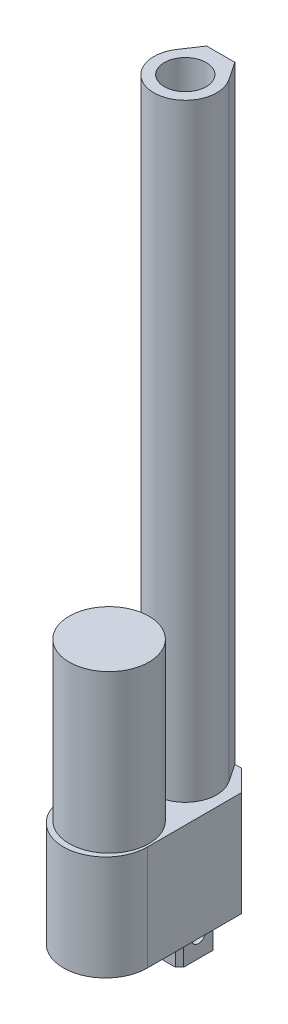
ISO-10303-21;
HEADER;
FILE_DESCRIPTION(('STEP AP214'),'2;1');
FILE_NAME('part.step','',(''),(''),'','','');
FILE_SCHEMA(('AUTOMOTIVE_DESIGN { 1 0 10303 214 1 1 1 1 }'));
ENDSEC;
DATA;
#1=APPLICATION_CONTEXT('core data for automotive mechanical design processes');
#2=APPLICATION_PROTOCOL_DEFINITION('international standard','automotive_design',2000,#1);
#3=PRODUCT_CONTEXT('',#1,'mechanical');
#4=PRODUCT('Part','Part','',(#3));
#5=PRODUCT_RELATED_PRODUCT_CATEGORY('part','',(#4));
#6=PRODUCT_DEFINITION_FORMATION('','',#4);
#7=PRODUCT_DEFINITION_CONTEXT('part definition',#1,'design');
#8=PRODUCT_DEFINITION('design','',#6,#7);
#9=PRODUCT_DEFINITION_SHAPE('','',#8);
#10=(LENGTH_UNIT() NAMED_UNIT(*) SI_UNIT(.MILLI.,.METRE.));
#11=(NAMED_UNIT(*) PLANE_ANGLE_UNIT() SI_UNIT($,.RADIAN.));
#12=(NAMED_UNIT(*) SI_UNIT($,.STERADIAN.) SOLID_ANGLE_UNIT());
#13=UNCERTAINTY_MEASURE_WITH_UNIT(LENGTH_MEASURE(1.E-05),#10,'distance_accuracy_value','');
#14=(GEOMETRIC_REPRESENTATION_CONTEXT(3) GLOBAL_UNCERTAINTY_ASSIGNED_CONTEXT((#13)) GLOBAL_UNIT_ASSIGNED_CONTEXT((#10,
#11,#12)) REPRESENTATION_CONTEXT('',''));
#15=CARTESIAN_POINT('',(0.,0.,0.));
#16=DIRECTION('',(0.,0.,1.));
#17=DIRECTION('',(1.,0.,0.));
#18=AXIS2_PLACEMENT_3D('',#15,#16,#17);
#19=CARTESIAN_POINT('',(0.,0.,27.5));
#20=DIRECTION('',(0.,1.,0.));
#21=DIRECTION('',(0.,0.,1.));
#22=AXIS2_PLACEMENT_3D('',#19,#20,#21);
#23=PLANE('',#22);
#24=DIRECTION('',(-1.,0.,0.));
#25=VECTOR('',#24,1.);
#26=CARTESIAN_POINT('',(-20.,0.,-27.5));
#27=LINE('',#26,#25);
#28=CARTESIAN_POINT('',(9.99999999999993,0.,-27.5));
#29=VERTEX_POINT('',#28);
#30=CARTESIAN_POINT('',(-10.,0.,-27.5));
#31=VERTEX_POINT('',#30);
#32=EDGE_CURVE('E217',#29,#31,#27,.T.);
#33=ORIENTED_EDGE('',*,*,#32,.F.);
#34=DIRECTION('',(-0.707106781186548,0.,-0.707106781186547));
#35=VECTOR('',#34,1.);
#36=CARTESIAN_POINT('',(9.99999999999993,0.,-27.5));
#37=LINE('',#36,#35);
#38=CARTESIAN_POINT('',(20.,0.,-17.4999999999999));
#39=VERTEX_POINT('',#38);
#40=EDGE_CURVE('E238',#29,#39,#37,.F.);
#41=ORIENTED_EDGE('',*,*,#40,.T.);
#42=DIRECTION('',(0.,0.,-1.));
#43=VECTOR('',#42,1.);
#44=CARTESIAN_POINT('',(20.,0.,-27.5));
#45=LINE('',#44,#43);
#46=CARTESIAN_POINT('',(20.,0.,27.5));
#47=VERTEX_POINT('',#46);
#48=EDGE_CURVE('E214',#47,#39,#45,.T.);
#49=ORIENTED_EDGE('',*,*,#48,.F.);
#50=CARTESIAN_POINT('',(0.,0.,27.5));
#51=DIRECTION('',(0.,1.,0.));
#52=DIRECTION('',(0.,0.,1.));
#53=AXIS2_PLACEMENT_3D('',#50,#51,#52);
#54=CIRCLE('',#53,20.);
#55=CARTESIAN_POINT('',(-20.,0.,27.5));
#56=VERTEX_POINT('',#55);
#57=EDGE_CURVE('E197',#56,#47,#54,.T.);
#58=ORIENTED_EDGE('',*,*,#57,.F.);
#59=DIRECTION('',(0.,0.,1.));
#60=VECTOR('',#59,1.);
#61=CARTESIAN_POINT('',(-20.,0.,-27.5));
#62=LINE('',#61,#60);
#63=CARTESIAN_POINT('',(-20.,0.,-17.5));
#64=VERTEX_POINT('',#63);
#65=EDGE_CURVE('E203',#64,#56,#62,.T.);
#66=ORIENTED_EDGE('',*,*,#65,.F.);
#67=DIRECTION('',(-0.70710678118655,0.,0.707106781186546));
#68=VECTOR('',#67,1.);
#69=CARTESIAN_POINT('',(-20.,0.,-17.5));
#70=LINE('',#69,#68);
#71=EDGE_CURVE('E236',#64,#31,#70,.F.);
#72=ORIENTED_EDGE('',*,*,#71,.T.);
#73=EDGE_LOOP('',(#33,#41,#49,#58,#66,#72));
#74=FACE_BOUND('',#73,.T.);
#75=DIRECTION('',(0.,0.,1.));
#76=VECTOR('',#75,1.);
#77=CARTESIAN_POINT('',(9.3326219700396,0.,1.5));
#78=LINE('',#77,#76);
#79=CARTESIAN_POINT('',(9.3326219700396,0.,-14.5));
#80=VERTEX_POINT('',#79);
#81=CARTESIAN_POINT('',(9.3326219700396,0.,-0.5));
#82=VERTEX_POINT('',#81);
#83=EDGE_CURVE('E230',#80,#82,#78,.T.);
#84=ORIENTED_EDGE('',*,*,#83,.F.);
#85=DIRECTION('',(0.707106781186548,0.,0.707106781186547));
#86=VECTOR('',#85,1.);
#87=CARTESIAN_POINT('',(25.6663109850198,0.,1.83368901498018));
#88=LINE('',#87,#86);
#89=CARTESIAN_POINT('',(7.3326219700396,0.,-16.5));
#90=VERTEX_POINT('',#89);
#91=EDGE_CURVE('E45',#80,#90,#88,.F.);
#92=ORIENTED_EDGE('',*,*,#91,.T.);
#93=DIRECTION('',(1.,0.,0.));
#94=VECTOR('',#93,1.);
#95=CARTESIAN_POINT('',(-8.6673780299604,0.,-16.5));
#96=LINE('',#95,#94);
#97=CARTESIAN_POINT('',(-6.6673780299604,0.,-16.5));
#98=VERTEX_POINT('',#97);
#99=EDGE_CURVE('E309',#98,#90,#96,.T.);
#100=ORIENTED_EDGE('',*,*,#99,.F.);
#101=DIRECTION('',(0.707106781186548,0.,-0.707106781186548));
#102=VECTOR('',#101,1.);
#103=CARTESIAN_POINT('',(-25.3336890149802,0.,2.16631098501981));
#104=LINE('',#103,#102);
#105=CARTESIAN_POINT('',(-8.6673780299604,0.,-14.5));
#106=VERTEX_POINT('',#105);
#107=EDGE_CURVE('E11',#98,#106,#104,.F.);
#108=ORIENTED_EDGE('',*,*,#107,.T.);
#109=DIRECTION('',(0.,0.,-1.));
#110=VECTOR('',#109,1.);
#111=CARTESIAN_POINT('',(-8.6673780299604,0.,1.5));
#112=LINE('',#111,#110);
#113=CARTESIAN_POINT('',(-8.6673780299604,0.,-0.499999999999945));
#114=VERTEX_POINT('',#113);
#115=EDGE_CURVE('E317',#114,#106,#112,.T.);
#116=ORIENTED_EDGE('',*,*,#115,.F.);
#117=DIRECTION('',(-0.707106781186548,0.,-0.707106781186548));
#118=VECTOR('',#117,1.);
#119=CARTESIAN_POINT('',(9.66631098501977,0.,17.8336890149802));
#120=LINE('',#119,#118);
#121=CARTESIAN_POINT('',(-6.66737802996046,0.,1.5));
#122=VERTEX_POINT('',#121);
#123=EDGE_CURVE('E276',#114,#122,#120,.F.);
#124=ORIENTED_EDGE('',*,*,#123,.T.);
#125=DIRECTION('',(-1.,0.,0.));
#126=VECTOR('',#125,1.);
#127=CARTESIAN_POINT('',(-8.6673780299604,0.,1.5));
#128=LINE('',#127,#126);
#129=CARTESIAN_POINT('',(7.33262197003959,0.,1.5));
#130=VERTEX_POINT('',#129);
#131=EDGE_CURVE('E282',#130,#122,#128,.T.);
#132=ORIENTED_EDGE('',*,*,#131,.F.);
#133=DIRECTION('',(-0.707106781186548,0.,0.707106781186548));
#134=VECTOR('',#133,1.);
#135=CARTESIAN_POINT('',(-9.3336890149802,0.,18.1663109850198));
#136=LINE('',#135,#134);
#137=EDGE_CURVE('E278',#130,#82,#136,.F.);
#138=ORIENTED_EDGE('',*,*,#137,.T.);
#139=EDGE_LOOP('',(#84,#92,#100,#108,#116,#124,#132,#138));
#140=FACE_BOUND('',#139,.T.);
#141=ADVANCED_FACE('F37',(#74,#140),#23,.F.);
#142=CARTESIAN_POINT('',(0.,50.,27.5));
#143=DIRECTION('',(0.,1.,0.));
#144=DIRECTION('',(0.,0.,1.));
#145=AXIS2_PLACEMENT_3D('',#142,#143,#144);
#146=PLANE('',#145);
#147=CARTESIAN_POINT('',(0.,50.,25.7726123452185));
#148=DIRECTION('',(0.,1.,0.));
#149=DIRECTION('',(0.,0.,1.));
#150=AXIS2_PLACEMENT_3D('',#147,#148,#149);
#151=CIRCLE('',#150,19.);
#152=CARTESIAN_POINT('',(0.,50.,44.7726123452185));
#153=VERTEX_POINT('',#152);
#154=EDGE_CURVE('E187',#153,#153,#151,.T.);
#155=ORIENTED_EDGE('',*,*,#154,.F.);
#156=EDGE_LOOP('',(#155));
#157=FACE_BOUND('',#156,.T.);
#158=DIRECTION('',(0.,0.,-1.));
#159=VECTOR('',#158,1.);
#160=CARTESIAN_POINT('',(20.,50.,-27.5));
#161=LINE('',#160,#159);
#162=CARTESIAN_POINT('',(20.,50.,27.5));
#163=VERTEX_POINT('',#162);
#164=CARTESIAN_POINT('',(20.,50.,-17.4999999999999));
#165=VERTEX_POINT('',#164);
#166=EDGE_CURVE('E202',#163,#165,#161,.T.);
#167=ORIENTED_EDGE('',*,*,#166,.T.);
#168=DIRECTION('',(0.707106781186548,0.,0.707106781186547));
#169=VECTOR('',#168,1.);
#170=CARTESIAN_POINT('',(32.5,50.,-4.99999999999997));
#171=LINE('',#170,#169);
#172=CARTESIAN_POINT('',(9.99999999999993,50.,-27.5));
#173=VERTEX_POINT('',#172);
#174=EDGE_CURVE('E244',#165,#173,#171,.F.);
#175=ORIENTED_EDGE('',*,*,#174,.T.);
#176=DIRECTION('',(-1.,0.,0.));
#177=VECTOR('',#176,1.);
#178=CARTESIAN_POINT('',(-20.,50.,-27.5));
#179=LINE('',#178,#177);
#180=CARTESIAN_POINT('',(6.73777580045175,50.,-27.5));
#181=VERTEX_POINT('',#180);
#182=EDGE_CURVE('E207',#173,#181,#179,.T.);
#183=ORIENTED_EDGE('',*,*,#182,.T.);
#184=DIRECTION('',(-0.555448260150939,0.,-0.831551099028373));
#185=VECTOR('',#184,1.);
#186=CARTESIAN_POINT('',(12.4732664854256,50.,-18.9135052268218));
#187=LINE('',#186,#185);
#188=CARTESIAN_POINT('',(12.4732664854256,50.,-18.9135052268218));
#189=VERTEX_POINT('',#188);
#190=EDGE_CURVE('E330',#189,#181,#187,.T.);
#191=ORIENTED_EDGE('',*,*,#190,.F.);
#192=CARTESIAN_POINT('',(0.,50.,-10.5817813245577));
#193=DIRECTION('',(0.,1.,0.));
#194=DIRECTION('',(0.,0.,1.));
#195=AXIS2_PLACEMENT_3D('',#192,#193,#194);
#196=CIRCLE('',#195,15.);
#197=CARTESIAN_POINT('',(-12.4732664854256,50.,-18.9135052268218));
#198=VERTEX_POINT('',#197);
#199=EDGE_CURVE('E185',#198,#189,#196,.T.);
#200=ORIENTED_EDGE('',*,*,#199,.F.);
#201=DIRECTION('',(-0.555448260150939,0.,0.831551099028373));
#202=VECTOR('',#201,1.);
#203=CARTESIAN_POINT('',(-12.4732664854256,50.,-18.9135052268218));
#204=LINE('',#203,#202);
#205=CARTESIAN_POINT('',(-6.73777580045176,50.,-27.5));
#206=VERTEX_POINT('',#205);
#207=EDGE_CURVE('E181',#206,#198,#204,.T.);
#208=ORIENTED_EDGE('',*,*,#207,.F.);
#209=CARTESIAN_POINT('',(-10.,50.,-27.5));
#210=VERTEX_POINT('',#209);
#211=EDGE_CURVE('E206',#206,#210,#179,.T.);
#212=ORIENTED_EDGE('',*,*,#211,.T.);
#213=DIRECTION('',(0.70710678118655,0.,-0.707106781186546));
#214=VECTOR('',#213,1.);
#215=CARTESIAN_POINT('',(-32.5,50.,-5.00000000000016));
#216=LINE('',#215,#214);
#217=CARTESIAN_POINT('',(-20.,50.,-17.5));
#218=VERTEX_POINT('',#217);
#219=EDGE_CURVE('E242',#210,#218,#216,.F.);
#220=ORIENTED_EDGE('',*,*,#219,.T.);
#221=DIRECTION('',(0.,0.,1.));
#222=VECTOR('',#221,1.);
#223=CARTESIAN_POINT('',(-20.,50.,-27.5));
#224=LINE('',#223,#222);
#225=CARTESIAN_POINT('',(-20.,50.,27.5));
#226=VERTEX_POINT('',#225);
#227=EDGE_CURVE('E209',#218,#226,#224,.T.);
#228=ORIENTED_EDGE('',*,*,#227,.T.);
#229=CARTESIAN_POINT('',(0.,50.,27.5));
#230=DIRECTION('',(0.,1.,0.));
#231=DIRECTION('',(0.,0.,1.));
#232=AXIS2_PLACEMENT_3D('',#229,#230,#231);
#233=CIRCLE('',#232,20.);
#234=EDGE_CURVE('E199',#226,#163,#233,.T.);
#235=ORIENTED_EDGE('',*,*,#234,.T.);
#236=EDGE_LOOP('',(#167,#175,#183,#191,#200,#208,#212,#220,#228,#235));
#237=FACE_BOUND('',#236,.T.);
#238=ADVANCED_FACE('F341',(#157,#237),#146,.T.);
#239=CARTESIAN_POINT('',(0.,50.,27.5));
#240=DIRECTION('',(0.,-1.,0.));
#241=DIRECTION('',(0.,0.,-1.));
#242=AXIS2_PLACEMENT_3D('',#239,#240,#241);
#243=CYLINDRICAL_SURFACE('',#242,20.);
#244=ORIENTED_EDGE('',*,*,#57,.T.);
#245=DIRECTION('',(0.,-1.,0.));
#246=VECTOR('',#245,1.);
#247=CARTESIAN_POINT('',(20.,50.,27.5));
#248=LINE('',#247,#246);
#249=EDGE_CURVE('E223',#163,#47,#248,.T.);
#250=ORIENTED_EDGE('',*,*,#249,.F.);
#251=ORIENTED_EDGE('',*,*,#234,.F.);
#252=DIRECTION('',(0.,-1.,0.));
#253=VECTOR('',#252,1.);
#254=CARTESIAN_POINT('',(-20.,50.,27.5));
#255=LINE('',#254,#253);
#256=EDGE_CURVE('E211',#226,#56,#255,.T.);
#257=ORIENTED_EDGE('',*,*,#256,.T.);
#258=EDGE_LOOP('',(#244,#250,#251,#257));
#259=FACE_BOUND('',#258,.T.);
#260=ADVANCED_FACE('F359',(#259),#243,.T.);
#261=CARTESIAN_POINT('',(20.,50.,-27.5));
#262=DIRECTION('',(-1.,0.,0.));
#263=DIRECTION('',(0.,0.,1.));
#264=AXIS2_PLACEMENT_3D('',#261,#262,#263);
#265=PLANE('',#264);
#266=ORIENTED_EDGE('',*,*,#48,.T.);
#267=DIRECTION('',(0.,1.,0.));
#268=VECTOR('',#267,1.);
#269=CARTESIAN_POINT('',(20.,50.,-17.4999999999999));
#270=LINE('',#269,#268);
#271=EDGE_CURVE('E240',#39,#165,#270,.T.);
#272=ORIENTED_EDGE('',*,*,#271,.T.);
#273=ORIENTED_EDGE('',*,*,#166,.F.);
#274=ORIENTED_EDGE('',*,*,#249,.T.);
#275=EDGE_LOOP('',(#266,#272,#273,#274));
#276=FACE_BOUND('',#275,.T.);
#277=ADVANCED_FACE('F367',(#276),#265,.F.);
#278=CARTESIAN_POINT('',(-20.,50.,-27.5));
#279=DIRECTION('',(0.,0.,1.));
#280=DIRECTION('',(1.,0.,0.));
#281=AXIS2_PLACEMENT_3D('',#278,#279,#280);
#282=PLANE('',#281);
#283=ORIENTED_EDGE('',*,*,#182,.F.);
#284=DIRECTION('',(0.,-1.,0.));
#285=VECTOR('',#284,1.);
#286=CARTESIAN_POINT('',(9.99999999999993,50.,-27.5));
#287=LINE('',#286,#285);
#288=EDGE_CURVE('E233',#173,#29,#287,.T.);
#289=ORIENTED_EDGE('',*,*,#288,.T.);
#290=ORIENTED_EDGE('',*,*,#32,.T.);
#291=DIRECTION('',(0.,1.,0.));
#292=VECTOR('',#291,1.);
#293=CARTESIAN_POINT('',(-10.,50.,-27.5));
#294=LINE('',#293,#292);
#295=EDGE_CURVE('E226',#31,#210,#294,.T.);
#296=ORIENTED_EDGE('',*,*,#295,.T.);
#297=ORIENTED_EDGE('',*,*,#211,.F.);
#298=DIRECTION('',(0.,-1.,0.));
#299=VECTOR('',#298,1.);
#300=CARTESIAN_POINT('',(-6.73777580045175,340.,-27.5));
#301=LINE('',#300,#299);
#302=CARTESIAN_POINT('',(-6.73777580045175,340.,-27.5));
#303=VERTEX_POINT('',#302);
#304=EDGE_CURVE('E192',#303,#206,#301,.T.);
#305=ORIENTED_EDGE('',*,*,#304,.F.);
#306=DIRECTION('',(-1.,0.,0.));
#307=VECTOR('',#306,1.);
#308=CARTESIAN_POINT('',(-6.73777580045175,340.,-27.5));
#309=LINE('',#308,#307);
#310=CARTESIAN_POINT('',(6.73777580045175,340.,-27.5));
#311=VERTEX_POINT('',#310);
#312=EDGE_CURVE('E171',#311,#303,#309,.T.);
#313=ORIENTED_EDGE('',*,*,#312,.F.);
#314=DIRECTION('',(0.,-1.,0.));
#315=VECTOR('',#314,1.);
#316=CARTESIAN_POINT('',(6.73777580045175,340.,-27.5));
#317=LINE('',#316,#315);
#318=EDGE_CURVE('E168',#311,#181,#317,.T.);
#319=ORIENTED_EDGE('',*,*,#318,.T.);
#320=EDGE_LOOP('',(#283,#289,#290,#296,#297,#305,#313,#319));
#321=FACE_BOUND('',#320,.T.);
#322=ADVANCED_FACE('F344',(#321),#282,.F.);
#323=CARTESIAN_POINT('',(-20.,50.,-27.5));
#324=DIRECTION('',(1.,0.,0.));
#325=DIRECTION('',(0.,0.,-1.));
#326=AXIS2_PLACEMENT_3D('',#323,#324,#325);
#327=PLANE('',#326);
#328=ORIENTED_EDGE('',*,*,#227,.F.);
#329=DIRECTION('',(0.,-1.,0.));
#330=VECTOR('',#329,1.);
#331=CARTESIAN_POINT('',(-20.,50.,-17.5));
#332=LINE('',#331,#330);
#333=EDGE_CURVE('E246',#218,#64,#332,.T.);
#334=ORIENTED_EDGE('',*,*,#333,.T.);
#335=ORIENTED_EDGE('',*,*,#65,.T.);
#336=ORIENTED_EDGE('',*,*,#256,.F.);
#337=EDGE_LOOP('',(#328,#334,#335,#336));
#338=FACE_BOUND('',#337,.T.);
#339=ADVANCED_FACE('F353',(#338),#327,.F.);
#340=CARTESIAN_POINT('',(0.,125.,25.7726123452185));
#341=DIRECTION('',(0.,-1.,0.));
#342=DIRECTION('',(0.,0.,-1.));
#343=AXIS2_PLACEMENT_3D('',#340,#341,#342);
#344=CYLINDRICAL_SURFACE('',#343,19.);
#345=CARTESIAN_POINT('',(0.,125.,25.7726123452185));
#346=DIRECTION('',(0.,1.,0.));
#347=DIRECTION('',(0.,0.,1.));
#348=AXIS2_PLACEMENT_3D('',#345,#346,#347);
#349=CIRCLE('',#348,19.);
#350=CARTESIAN_POINT('',(0.,125.,44.7726123452185));
#351=VERTEX_POINT('',#350);
#352=EDGE_CURVE('E190',#351,#351,#349,.T.);
#353=ORIENTED_EDGE('',*,*,#352,.F.);
#354=EDGE_LOOP('',(#353));
#355=FACE_BOUND('',#354,.T.);
#356=ORIENTED_EDGE('',*,*,#154,.T.);
#357=EDGE_LOOP('',(#356));
#358=FACE_BOUND('',#357,.T.);
#359=ADVANCED_FACE('F386',(#355,#358),#344,.T.);
#360=CARTESIAN_POINT('',(0.,125.,25.7726123452185));
#361=DIRECTION('',(0.,1.,0.));
#362=DIRECTION('',(0.,0.,1.));
#363=AXIS2_PLACEMENT_3D('',#360,#361,#362);
#364=PLANE('',#363);
#365=ORIENTED_EDGE('',*,*,#352,.T.);
#366=EDGE_LOOP('',(#365));
#367=FACE_BOUND('',#366,.T.);
#368=ADVANCED_FACE('F390',(#367),#364,.T.);
#369=CARTESIAN_POINT('',(0.,340.,-10.5817813245577));
#370=DIRECTION('',(0.,-1.,0.));
#371=DIRECTION('',(0.,0.,-1.));
#372=AXIS2_PLACEMENT_3D('',#369,#370,#371);
#373=CYLINDRICAL_SURFACE('',#372,15.);
#374=ORIENTED_EDGE('',*,*,#199,.T.);
#375=DIRECTION('',(0.,-1.,0.));
#376=VECTOR('',#375,1.);
#377=CARTESIAN_POINT('',(12.4732664854256,340.,-18.9135052268218));
#378=LINE('',#377,#376);
#379=CARTESIAN_POINT('',(12.4732664854256,340.,-18.9135052268218));
#380=VERTEX_POINT('',#379);
#381=EDGE_CURVE('E165',#380,#189,#378,.T.);
#382=ORIENTED_EDGE('',*,*,#381,.F.);
#383=CARTESIAN_POINT('',(0.,340.,-10.5817813245577));
#384=DIRECTION('',(0.,1.,0.));
#385=DIRECTION('',(0.,0.,1.));
#386=AXIS2_PLACEMENT_3D('',#383,#384,#385);
#387=CIRCLE('',#386,15.);
#388=CARTESIAN_POINT('',(-12.4732664854256,340.,-18.9135052268218));
#389=VERTEX_POINT('',#388);
#390=EDGE_CURVE('E172',#389,#380,#387,.T.);
#391=ORIENTED_EDGE('',*,*,#390,.F.);
#392=DIRECTION('',(0.,-1.,0.));
#393=VECTOR('',#392,1.);
#394=CARTESIAN_POINT('',(-12.4732664854256,340.,-18.9135052268218));
#395=LINE('',#394,#393);
#396=EDGE_CURVE('E328',#389,#198,#395,.T.);
#397=ORIENTED_EDGE('',*,*,#396,.T.);
#398=EDGE_LOOP('',(#374,#382,#391,#397));
#399=FACE_BOUND('',#398,.T.);
#400=ADVANCED_FACE('F183',(#399),#373,.T.);
#401=CARTESIAN_POINT('',(12.4732664854256,340.,-18.9135052268218));
#402=DIRECTION('',(-0.831551099028373,0.,0.555448260150939));
#403=DIRECTION('',(0.555448260150939,0.,0.831551099028373));
#404=AXIS2_PLACEMENT_3D('',#401,#402,#403);
#405=PLANE('',#404);
#406=ORIENTED_EDGE('',*,*,#190,.T.);
#407=ORIENTED_EDGE('',*,*,#318,.F.);
#408=DIRECTION('',(-0.555448260150939,0.,-0.831551099028373));
#409=VECTOR('',#408,1.);
#410=CARTESIAN_POINT('',(12.4732664854256,340.,-18.9135052268218));
#411=LINE('',#410,#409);
#412=EDGE_CURVE('E160',#380,#311,#411,.T.);
#413=ORIENTED_EDGE('',*,*,#412,.F.);
#414=ORIENTED_EDGE('',*,*,#381,.T.);
#415=EDGE_LOOP('',(#406,#407,#413,#414));
#416=FACE_BOUND('',#415,.T.);
#417=ADVANCED_FACE('F163',(#416),#405,.F.);
#418=CARTESIAN_POINT('',(-12.4732664854256,340.,-18.9135052268218));
#419=DIRECTION('',(0.831551099028373,0.,0.555448260150939));
#420=DIRECTION('',(0.555448260150939,0.,-0.831551099028373));
#421=AXIS2_PLACEMENT_3D('',#418,#419,#420);
#422=PLANE('',#421);
#423=ORIENTED_EDGE('',*,*,#207,.T.);
#424=ORIENTED_EDGE('',*,*,#396,.F.);
#425=DIRECTION('',(-0.555448260150939,0.,0.831551099028373));
#426=VECTOR('',#425,1.);
#427=CARTESIAN_POINT('',(-12.4732664854256,340.,-18.9135052268218));
#428=LINE('',#427,#426);
#429=EDGE_CURVE('E177',#303,#389,#428,.T.);
#430=ORIENTED_EDGE('',*,*,#429,.F.);
#431=ORIENTED_EDGE('',*,*,#304,.T.);
#432=EDGE_LOOP('',(#423,#424,#430,#431));
#433=FACE_BOUND('',#432,.T.);
#434=ADVANCED_FACE('F336',(#433),#422,.F.);
#435=CARTESIAN_POINT('',(0.,340.,-10.5817813245577));
#436=DIRECTION('',(0.,1.,0.));
#437=DIRECTION('',(0.,0.,1.));
#438=AXIS2_PLACEMENT_3D('',#435,#436,#437);
#439=PLANE('',#438);
#440=CARTESIAN_POINT('',(0.,340.,-10.5817813245577));
#441=DIRECTION('',(0.,1.,0.));
#442=DIRECTION('',(0.,0.,1.));
#443=AXIS2_PLACEMENT_3D('',#440,#441,#442);
#444=CIRCLE('',#443,10.);
#445=CARTESIAN_POINT('',(0.,340.,-0.581781324557676));
#446=VERTEX_POINT('',#445);
#447=EDGE_CURVE('E314',#446,#446,#444,.T.);
#448=ORIENTED_EDGE('',*,*,#447,.F.);
#449=EDGE_LOOP('',(#448));
#450=FACE_BOUND('',#449,.T.);
#451=ORIENTED_EDGE('',*,*,#390,.T.);
#452=ORIENTED_EDGE('',*,*,#412,.T.);
#453=ORIENTED_EDGE('',*,*,#312,.T.);
#454=ORIENTED_EDGE('',*,*,#429,.T.);
#455=EDGE_LOOP('',(#451,#452,#453,#454));
#456=FACE_BOUND('',#455,.T.);
#457=ADVANCED_FACE('F175',(#450,#456),#439,.T.);
#458=CARTESIAN_POINT('',(0.,170.,-10.5817813245577));
#459=DIRECTION('',(0.,1.,0.));
#460=DIRECTION('',(0.,0.,1.));
#461=AXIS2_PLACEMENT_3D('',#458,#459,#460);
#462=CYLINDRICAL_SURFACE('',#461,10.);
#463=CARTESIAN_POINT('',(0.,170.,-10.5817813245577));
#464=DIRECTION('',(0.,1.,0.));
#465=DIRECTION('',(0.,0.,1.));
#466=AXIS2_PLACEMENT_3D('',#463,#464,#465);
#467=CIRCLE('',#466,10.);
#468=CARTESIAN_POINT('',(0.,170.,-0.581781324557676));
#469=VERTEX_POINT('',#468);
#470=EDGE_CURVE('E321',#469,#469,#467,.T.);
#471=ORIENTED_EDGE('',*,*,#470,.F.);
#472=EDGE_LOOP('',(#471));
#473=FACE_BOUND('',#472,.T.);
#474=ORIENTED_EDGE('',*,*,#447,.T.);
#475=EDGE_LOOP('',(#474));
#476=FACE_BOUND('',#475,.T.);
#477=ADVANCED_FACE('F408',(#473,#476),#462,.F.);
#478=CARTESIAN_POINT('',(0.,170.,-10.5817813245577));
#479=DIRECTION('',(0.,1.,0.));
#480=DIRECTION('',(0.,0.,1.));
#481=AXIS2_PLACEMENT_3D('',#478,#479,#480);
#482=PLANE('',#481);
#483=ORIENTED_EDGE('',*,*,#470,.T.);
#484=EDGE_LOOP('',(#483));
#485=FACE_BOUND('',#484,.T.);
#486=ADVANCED_FACE('F412',(#485),#482,.T.);
#487=CARTESIAN_POINT('',(9.3326219700396,-19.,1.5));
#488=DIRECTION('',(-1.,0.,0.));
#489=DIRECTION('',(0.,0.,1.));
#490=AXIS2_PLACEMENT_3D('',#487,#488,#489);
#491=PLANE('',#490);
#492=CARTESIAN_POINT('',(9.3326219700396,-9.5,-7.5));
#493=DIRECTION('',(1.,0.,0.));
#494=DIRECTION('',(0.,0.,-1.));
#495=AXIS2_PLACEMENT_3D('',#492,#493,#494);
#496=CIRCLE('',#495,3.25);
#497=CARTESIAN_POINT('',(9.3326219700396,-9.5,-10.75));
#498=VERTEX_POINT('',#497);
#499=EDGE_CURVE('E231',#498,#498,#496,.T.);
#500=ORIENTED_EDGE('',*,*,#499,.F.);
#501=EDGE_LOOP('',(#500));
#502=FACE_BOUND('',#501,.T.);
#503=ORIENTED_EDGE('',*,*,#83,.T.);
#504=DIRECTION('',(0.,-1.,0.));
#505=VECTOR('',#504,1.);
#506=CARTESIAN_POINT('',(9.3326219700396,-19.,-0.5));
#507=LINE('',#506,#505);
#508=CARTESIAN_POINT('',(9.3326219700396,-19.,-0.5));
#509=VERTEX_POINT('',#508);
#510=EDGE_CURVE('E270',#82,#509,#507,.T.);
#511=ORIENTED_EDGE('',*,*,#510,.T.);
#512=DIRECTION('',(0.,0.,1.));
#513=VECTOR('',#512,1.);
#514=CARTESIAN_POINT('',(9.3326219700396,-19.,1.5));
#515=LINE('',#514,#513);
#516=CARTESIAN_POINT('',(9.3326219700396,-19.,-14.5));
#517=VERTEX_POINT('',#516);
#518=EDGE_CURVE('E300',#517,#509,#515,.T.);
#519=ORIENTED_EDGE('',*,*,#518,.F.);
#520=DIRECTION('',(0.,1.,0.));
#521=VECTOR('',#520,1.);
#522=CARTESIAN_POINT('',(9.3326219700396,-19.,-14.5));
#523=LINE('',#522,#521);
#524=EDGE_CURVE('E267',#517,#80,#523,.T.);
#525=ORIENTED_EDGE('',*,*,#524,.T.);
#526=EDGE_LOOP('',(#503,#511,#519,#525));
#527=FACE_BOUND('',#526,.T.);
#528=ADVANCED_FACE('F287',(#502,#527),#491,.F.);
#529=CARTESIAN_POINT('',(-8.6673780299604,-19.,1.5));
#530=DIRECTION('',(0.,0.,-1.));
#531=DIRECTION('',(-1.,0.,0.));
#532=AXIS2_PLACEMENT_3D('',#529,#530,#531);
#533=PLANE('',#532);
#534=ORIENTED_EDGE('',*,*,#131,.T.);
#535=DIRECTION('',(0.,-1.,0.));
#536=VECTOR('',#535,1.);
#537=CARTESIAN_POINT('',(-6.66737802996046,-19.,1.5));
#538=LINE('',#537,#536);
#539=CARTESIAN_POINT('',(-6.66737802996046,-19.,1.5));
#540=VERTEX_POINT('',#539);
#541=EDGE_CURVE('E257',#122,#540,#538,.T.);
#542=ORIENTED_EDGE('',*,*,#541,.T.);
#543=DIRECTION('',(-1.,0.,0.));
#544=VECTOR('',#543,1.);
#545=CARTESIAN_POINT('',(-8.6673780299604,-19.,1.5));
#546=LINE('',#545,#544);
#547=CARTESIAN_POINT('',(7.33262197003959,-19.,1.5));
#548=VERTEX_POINT('',#547);
#549=EDGE_CURVE('E298',#548,#540,#546,.T.);
#550=ORIENTED_EDGE('',*,*,#549,.F.);
#551=DIRECTION('',(0.,1.,0.));
#552=VECTOR('',#551,1.);
#553=CARTESIAN_POINT('',(7.33262197003959,-19.,1.5));
#554=LINE('',#553,#552);
#555=EDGE_CURVE('E254',#548,#130,#554,.T.);
#556=ORIENTED_EDGE('',*,*,#555,.T.);
#557=EDGE_LOOP('',(#534,#542,#550,#556));
#558=FACE_BOUND('',#557,.T.);
#559=ADVANCED_FACE('F302',(#558),#533,.F.);
#560=CARTESIAN_POINT('',(-8.6673780299604,-19.,1.5));
#561=DIRECTION('',(1.,0.,0.));
#562=DIRECTION('',(0.,0.,-1.));
#563=AXIS2_PLACEMENT_3D('',#560,#561,#562);
#564=PLANE('',#563);
#565=CARTESIAN_POINT('',(-8.6673780299604,-9.5,-7.5));
#566=DIRECTION('',(1.,0.,0.));
#567=DIRECTION('',(0.,0.,-1.));
#568=AXIS2_PLACEMENT_3D('',#565,#566,#567);
#569=CIRCLE('',#568,3.25);
#570=CARTESIAN_POINT('',(-8.6673780299604,-9.5,-10.75));
#571=VERTEX_POINT('',#570);
#572=EDGE_CURVE('E227',#571,#571,#569,.T.);
#573=ORIENTED_EDGE('',*,*,#572,.T.);
#574=EDGE_LOOP('',(#573));
#575=FACE_BOUND('',#574,.T.);
#576=DIRECTION('',(0.,0.,-1.));
#577=VECTOR('',#576,1.);
#578=CARTESIAN_POINT('',(-8.6673780299604,-19.,1.5));
#579=LINE('',#578,#577);
#580=CARTESIAN_POINT('',(-8.6673780299604,-19.,-0.499999999999945));
#581=VERTEX_POINT('',#580);
#582=CARTESIAN_POINT('',(-8.6673780299604,-19.,-14.5));
#583=VERTEX_POINT('',#582);
#584=EDGE_CURVE('E304',#581,#583,#579,.T.);
#585=ORIENTED_EDGE('',*,*,#584,.F.);
#586=DIRECTION('',(0.,1.,0.));
#587=VECTOR('',#586,1.);
#588=CARTESIAN_POINT('',(-8.6673780299604,-19.,-0.499999999999945));
#589=LINE('',#588,#587);
#590=EDGE_CURVE('E251',#581,#114,#589,.T.);
#591=ORIENTED_EDGE('',*,*,#590,.T.);
#592=ORIENTED_EDGE('',*,*,#115,.T.);
#593=DIRECTION('',(0.,-1.,0.));
#594=VECTOR('',#593,1.);
#595=CARTESIAN_POINT('',(-8.6673780299604,-19.,-14.5));
#596=LINE('',#595,#594);
#597=EDGE_CURVE('E249',#106,#583,#596,.T.);
#598=ORIENTED_EDGE('',*,*,#597,.T.);
#599=EDGE_LOOP('',(#585,#591,#592,#598));
#600=FACE_BOUND('',#599,.T.);
#601=ADVANCED_FACE('F422',(#575,#600),#564,.F.);
#602=CARTESIAN_POINT('',(-8.6673780299604,-19.,-16.5));
#603=DIRECTION('',(0.,0.,1.));
#604=DIRECTION('',(1.,0.,0.));
#605=AXIS2_PLACEMENT_3D('',#602,#603,#604);
#606=PLANE('',#605);
#607=ORIENTED_EDGE('',*,*,#99,.T.);
#608=DIRECTION('',(0.,-1.,0.));
#609=VECTOR('',#608,1.);
#610=CARTESIAN_POINT('',(7.3326219700396,-19.,-16.5));
#611=LINE('',#610,#609);
#612=CARTESIAN_POINT('',(7.3326219700396,-19.,-16.5));
#613=VERTEX_POINT('',#612);
#614=EDGE_CURVE('E274',#90,#613,#611,.T.);
#615=ORIENTED_EDGE('',*,*,#614,.T.);
#616=DIRECTION('',(1.,0.,0.));
#617=VECTOR('',#616,1.);
#618=CARTESIAN_POINT('',(-8.6673780299604,-19.,-16.5));
#619=LINE('',#618,#617);
#620=CARTESIAN_POINT('',(-6.6673780299604,-19.,-16.5));
#621=VERTEX_POINT('',#620);
#622=EDGE_CURVE('E307',#621,#613,#619,.T.);
#623=ORIENTED_EDGE('',*,*,#622,.F.);
#624=DIRECTION('',(0.,1.,0.));
#625=VECTOR('',#624,1.);
#626=CARTESIAN_POINT('',(-6.6673780299604,-19.,-16.5));
#627=LINE('',#626,#625);
#628=EDGE_CURVE('E272',#621,#98,#627,.T.);
#629=ORIENTED_EDGE('',*,*,#628,.T.);
#630=EDGE_LOOP('',(#607,#615,#623,#629));
#631=FACE_BOUND('',#630,.T.);
#632=ADVANCED_FACE('F425',(#631),#606,.F.);
#633=CARTESIAN_POINT('',(0.,-19.,0.));
#634=DIRECTION('',(0.,-1.,0.));
#635=DIRECTION('',(0.,0.,-1.));
#636=AXIS2_PLACEMENT_3D('',#633,#634,#635);
#637=PLANE('',#636);
#638=ORIENTED_EDGE('',*,*,#549,.T.);
#639=DIRECTION('',(0.707106781186548,0.,0.707106781186548));
#640=VECTOR('',#639,1.);
#641=CARTESIAN_POINT('',(-4.08368901498023,-19.,4.08368901498023));
#642=LINE('',#641,#640);
#643=EDGE_CURVE('E265',#540,#581,#642,.F.);
#644=ORIENTED_EDGE('',*,*,#643,.T.);
#645=ORIENTED_EDGE('',*,*,#584,.T.);
#646=DIRECTION('',(-0.707106781186548,0.,0.707106781186548));
#647=VECTOR('',#646,1.);
#648=CARTESIAN_POINT('',(-11.5836890149802,-19.,-11.5836890149802));
#649=LINE('',#648,#647);
#650=EDGE_CURVE('E259',#583,#621,#649,.F.);
#651=ORIENTED_EDGE('',*,*,#650,.T.);
#652=ORIENTED_EDGE('',*,*,#622,.T.);
#653=DIRECTION('',(-0.707106781186548,0.,-0.707106781186547));
#654=VECTOR('',#653,1.);
#655=CARTESIAN_POINT('',(11.9163109850198,-19.,-11.9163109850198));
#656=LINE('',#655,#654);
#657=EDGE_CURVE('E261',#613,#517,#656,.F.);
#658=ORIENTED_EDGE('',*,*,#657,.T.);
#659=ORIENTED_EDGE('',*,*,#518,.T.);
#660=DIRECTION('',(0.707106781186548,0.,-0.707106781186548));
#661=VECTOR('',#660,1.);
#662=CARTESIAN_POINT('',(4.4163109850198,-19.,4.4163109850198));
#663=LINE('',#662,#661);
#664=EDGE_CURVE('E263',#509,#548,#663,.F.);
#665=ORIENTED_EDGE('',*,*,#664,.T.);
#666=EDGE_LOOP('',(#638,#644,#645,#651,#652,#658,#659,#665));
#667=FACE_BOUND('',#666,.T.);
#668=ADVANCED_FACE('F297',(#667),#637,.T.);
#669=CARTESIAN_POINT('',(-9.6673780299604,-9.5,-7.5));
#670=DIRECTION('',(1.,0.,0.));
#671=DIRECTION('',(0.,0.,-1.));
#672=AXIS2_PLACEMENT_3D('',#669,#670,#671);
#673=CYLINDRICAL_SURFACE('',#672,3.25);
#674=ORIENTED_EDGE('',*,*,#499,.T.);
#675=EDGE_LOOP('',(#674));
#676=FACE_BOUND('',#675,.T.);
#677=ORIENTED_EDGE('',*,*,#572,.F.);
#678=EDGE_LOOP('',(#677));
#679=FACE_BOUND('',#678,.T.);
#680=ADVANCED_FACE('F432',(#676,#679),#673,.F.);
#681=CARTESIAN_POINT('',(9.99999999999993,50.,-27.5));
#682=DIRECTION('',(-0.707106781186547,0.,0.707106781186548));
#683=DIRECTION('',(0.,-1.,0.));
#684=AXIS2_PLACEMENT_3D('',#681,#682,#683);
#685=PLANE('',#684);
#686=ORIENTED_EDGE('',*,*,#174,.F.);
#687=ORIENTED_EDGE('',*,*,#271,.F.);
#688=ORIENTED_EDGE('',*,*,#40,.F.);
#689=ORIENTED_EDGE('',*,*,#288,.F.);
#690=EDGE_LOOP('',(#686,#687,#688,#689));
#691=FACE_BOUND('',#690,.T.);
#692=ADVANCED_FACE('F365',(#691),#685,.F.);
#693=CARTESIAN_POINT('',(-20.,50.,-17.5));
#694=DIRECTION('',(0.707106781186546,0.,0.70710678118655));
#695=DIRECTION('',(0.,-1.,0.));
#696=AXIS2_PLACEMENT_3D('',#693,#694,#695);
#697=PLANE('',#696);
#698=ORIENTED_EDGE('',*,*,#219,.F.);
#699=ORIENTED_EDGE('',*,*,#295,.F.);
#700=ORIENTED_EDGE('',*,*,#71,.F.);
#701=ORIENTED_EDGE('',*,*,#333,.F.);
#702=EDGE_LOOP('',(#698,#699,#700,#701));
#703=FACE_BOUND('',#702,.T.);
#704=ADVANCED_FACE('F348',(#703),#697,.F.);
#705=CARTESIAN_POINT('',(-8.6673780299604,-19.,-0.499999999999945));
#706=DIRECTION('',(0.707106781186548,0.,-0.707106781186548));
#707=DIRECTION('',(0.,1.,0.));
#708=AXIS2_PLACEMENT_3D('',#705,#706,#707);
#709=PLANE('',#708);
#710=ORIENTED_EDGE('',*,*,#643,.F.);
#711=ORIENTED_EDGE('',*,*,#541,.F.);
#712=ORIENTED_EDGE('',*,*,#123,.F.);
#713=ORIENTED_EDGE('',*,*,#590,.F.);
#714=EDGE_LOOP('',(#710,#711,#712,#713));
#715=FACE_BOUND('',#714,.T.);
#716=ADVANCED_FACE('F449',(#715),#709,.F.);
#717=CARTESIAN_POINT('',(7.33262197003959,-19.,1.5));
#718=DIRECTION('',(-0.707106781186547,0.,-0.707106781186547));
#719=DIRECTION('',(0.,1.,0.));
#720=AXIS2_PLACEMENT_3D('',#717,#718,#719);
#721=PLANE('',#720);
#722=ORIENTED_EDGE('',*,*,#664,.F.);
#723=ORIENTED_EDGE('',*,*,#510,.F.);
#724=ORIENTED_EDGE('',*,*,#137,.F.);
#725=ORIENTED_EDGE('',*,*,#555,.F.);
#726=EDGE_LOOP('',(#722,#723,#724,#725));
#727=FACE_BOUND('',#726,.T.);
#728=ADVANCED_FACE('F293',(#727),#721,.F.);
#729=CARTESIAN_POINT('',(9.3326219700396,-19.,-14.5));
#730=DIRECTION('',(-0.707106781186547,0.,0.707106781186548));
#731=DIRECTION('',(0.,1.,0.));
#732=AXIS2_PLACEMENT_3D('',#729,#730,#731);
#733=PLANE('',#732);
#734=ORIENTED_EDGE('',*,*,#657,.F.);
#735=ORIENTED_EDGE('',*,*,#614,.F.);
#736=ORIENTED_EDGE('',*,*,#91,.F.);
#737=ORIENTED_EDGE('',*,*,#524,.F.);
#738=EDGE_LOOP('',(#734,#735,#736,#737));
#739=FACE_BOUND('',#738,.T.);
#740=ADVANCED_FACE('F454',(#739),#733,.F.);
#741=CARTESIAN_POINT('',(-6.6673780299604,-19.,-16.5));
#742=DIRECTION('',(0.707106781186547,0.,0.707106781186547));
#743=DIRECTION('',(0.,1.,0.));
#744=AXIS2_PLACEMENT_3D('',#741,#742,#743);
#745=PLANE('',#744);
#746=ORIENTED_EDGE('',*,*,#650,.F.);
#747=ORIENTED_EDGE('',*,*,#597,.F.);
#748=ORIENTED_EDGE('',*,*,#107,.F.);
#749=ORIENTED_EDGE('',*,*,#628,.F.);
#750=EDGE_LOOP('',(#746,#747,#748,#749));
#751=FACE_BOUND('',#750,.T.);
#752=ADVANCED_FACE('F39',(#751),#745,.F.);
#753=CLOSED_SHELL('',(#141,#238,#260,#277,#322,#339,#359,#368,#400,#417,#434,#457,#477,#486,
#528,#559,#601,#632,#668,#680,#692,#704,#716,#728,#740,#752));
#754=MANIFOLD_SOLID_BREP('B2',#753);
#755=ADVANCED_BREP_SHAPE_REPRESENTATION('',(#18,#754),#14);
#756=SHAPE_DEFINITION_REPRESENTATION(#9,#755);
ENDSEC;
END-ISO-10303-21;
